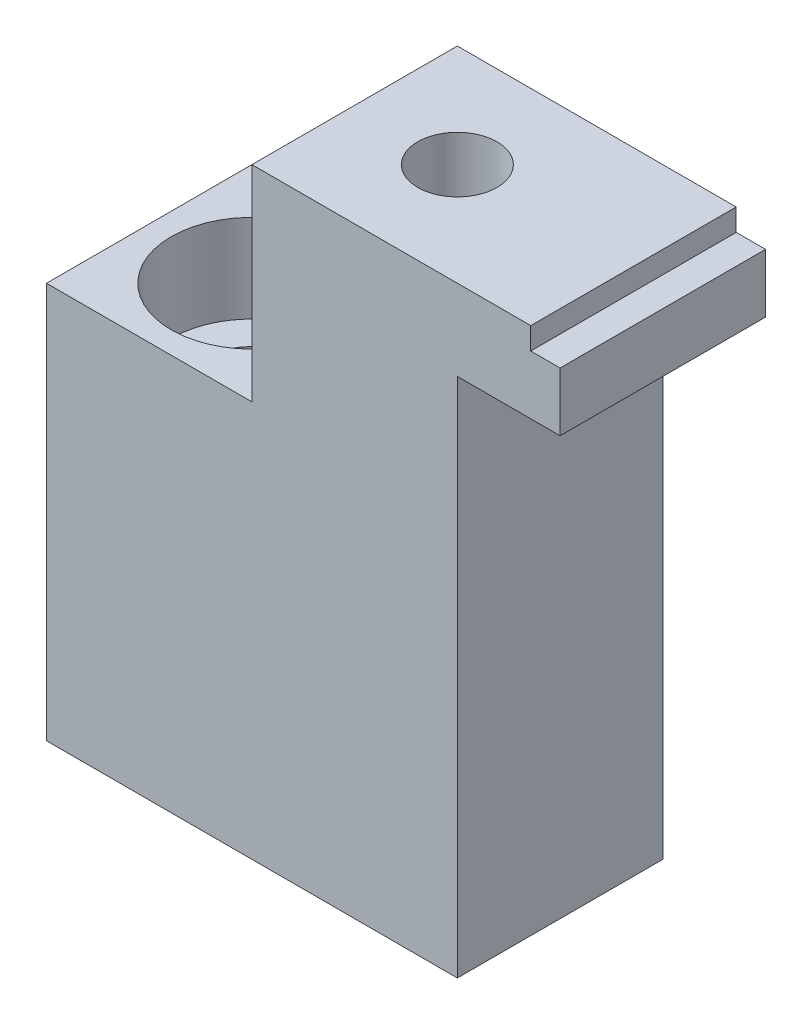
ISO-10303-21;
HEADER;
FILE_DESCRIPTION(('STEP AP214'),'2;1');
FILE_NAME('part.step','',(''),(''),'','','');
FILE_SCHEMA(('AUTOMOTIVE_DESIGN { 1 0 10303 214 1 1 1 1 }'));
ENDSEC;
DATA;
#1=APPLICATION_CONTEXT('core data for automotive mechanical design processes');
#2=APPLICATION_PROTOCOL_DEFINITION('international standard','automotive_design',2000,#1);
#3=PRODUCT_CONTEXT('',#1,'mechanical');
#4=PRODUCT('Part','Part','',(#3));
#5=PRODUCT_RELATED_PRODUCT_CATEGORY('part','',(#4));
#6=PRODUCT_DEFINITION_FORMATION('','',#4);
#7=PRODUCT_DEFINITION_CONTEXT('part definition',#1,'design');
#8=PRODUCT_DEFINITION('design','',#6,#7);
#9=PRODUCT_DEFINITION_SHAPE('','',#8);
#10=(LENGTH_UNIT() NAMED_UNIT(*) SI_UNIT(.MILLI.,.METRE.));
#11=(NAMED_UNIT(*) PLANE_ANGLE_UNIT() SI_UNIT($,.RADIAN.));
#12=(NAMED_UNIT(*) SI_UNIT($,.STERADIAN.) SOLID_ANGLE_UNIT());
#13=UNCERTAINTY_MEASURE_WITH_UNIT(LENGTH_MEASURE(1.E-05),#10,'distance_accuracy_value','');
#14=(GEOMETRIC_REPRESENTATION_CONTEXT(3) GLOBAL_UNCERTAINTY_ASSIGNED_CONTEXT((#13)) GLOBAL_UNIT_ASSIGNED_CONTEXT((#10,
#11,#12)) REPRESENTATION_CONTEXT('',''));
#15=CARTESIAN_POINT('',(0.,0.,0.));
#16=DIRECTION('',(0.,0.,1.));
#17=DIRECTION('',(1.,0.,0.));
#18=AXIS2_PLACEMENT_3D('',#15,#16,#17);
#19=CARTESIAN_POINT('',(-3.5,-4.40000000000001,3.5));
#20=DIRECTION('',(0.,1.,0.));
#21=DIRECTION('',(-1.,0.,0.));
#22=AXIS2_PLACEMENT_3D('',#19,#20,#21);
#23=CYLINDRICAL_SURFACE('',#22,1.6);
#24=CARTESIAN_POINT('',(-3.5,6.5,3.5));
#25=DIRECTION('',(0.,1.,0.));
#26=DIRECTION('',(-1.,0.,0.));
#27=AXIS2_PLACEMENT_3D('',#24,#25,#26);
#28=CIRCLE('',#27,1.6);
#29=CARTESIAN_POINT('',(-5.1,6.5,3.5));
#30=VERTEX_POINT('',#29);
#31=EDGE_CURVE('E37',#30,#30,#28,.F.);
#32=ORIENTED_EDGE('',*,*,#31,.F.);
#33=EDGE_LOOP('',(#32));
#34=FACE_BOUND('',#33,.T.);
#35=CARTESIAN_POINT('',(-3.5,-4.,3.5));
#36=DIRECTION('',(0.,1.,0.));
#37=DIRECTION('',(0.,0.,1.));
#38=AXIS2_PLACEMENT_3D('',#35,#36,#37);
#39=CIRCLE('',#38,1.6);
#40=CARTESIAN_POINT('',(-3.5,-4.,5.1));
#41=VERTEX_POINT('',#40);
#42=EDGE_CURVE('E216',#41,#41,#39,.T.);
#43=ORIENTED_EDGE('',*,*,#42,.F.);
#44=EDGE_LOOP('',(#43));
#45=FACE_BOUND('',#44,.T.);
#46=ADVANCED_FACE('F33',(#34,#45),#23,.F.);
#47=CARTESIAN_POINT('',(7.,-4.,7.));
#48=DIRECTION('',(0.,1.,0.));
#49=DIRECTION('',(0.,0.,1.));
#50=AXIS2_PLACEMENT_3D('',#47,#48,#49);
#51=PLANE('',#50);
#52=DIRECTION('',(1.,0.,0.));
#53=VECTOR('',#52,1.);
#54=CARTESIAN_POINT('',(7.,-4.,0.));
#55=LINE('',#54,#53);
#56=CARTESIAN_POINT('',(-7.,-4.,0.));
#57=VERTEX_POINT('',#56);
#58=CARTESIAN_POINT('',(7.,-4.,0.));
#59=VERTEX_POINT('',#58);
#60=EDGE_CURVE('E141',#57,#59,#55,.T.);
#61=ORIENTED_EDGE('',*,*,#60,.T.);
#62=DIRECTION('',(0.,0.,-1.));
#63=VECTOR('',#62,1.);
#64=CARTESIAN_POINT('',(7.,-4.,7.));
#65=LINE('',#64,#63);
#66=CARTESIAN_POINT('',(7.,-4.,7.));
#67=VERTEX_POINT('',#66);
#68=EDGE_CURVE('E11',#67,#59,#65,.T.);
#69=ORIENTED_EDGE('',*,*,#68,.F.);
#70=DIRECTION('',(1.,0.,0.));
#71=VECTOR('',#70,1.);
#72=CARTESIAN_POINT('',(7.,-4.,7.));
#73=LINE('',#72,#71);
#74=CARTESIAN_POINT('',(-7.,-4.,7.));
#75=VERTEX_POINT('',#74);
#76=EDGE_CURVE('E97',#75,#67,#73,.T.);
#77=ORIENTED_EDGE('',*,*,#76,.F.);
#78=DIRECTION('',(0.,0.,1.));
#79=VECTOR('',#78,1.);
#80=CARTESIAN_POINT('',(-7.,-4.,7.));
#81=LINE('',#80,#79);
#82=EDGE_CURVE('E221',#57,#75,#81,.T.);
#83=ORIENTED_EDGE('',*,*,#82,.F.);
#84=EDGE_LOOP('',(#61,#69,#77,#83));
#85=FACE_BOUND('',#84,.T.);
#86=ORIENTED_EDGE('',*,*,#42,.T.);
#87=EDGE_LOOP('',(#86));
#88=FACE_BOUND('',#87,.T.);
#89=ADVANCED_FACE('F35',(#85,#88),#51,.F.);
#90=CARTESIAN_POINT('',(7.,0.,7.));
#91=DIRECTION('',(-1.,0.,0.));
#92=DIRECTION('',(0.,0.,1.));
#93=AXIS2_PLACEMENT_3D('',#90,#91,#92);
#94=PLANE('',#93);
#95=DIRECTION('',(0.,1.,0.));
#96=VECTOR('',#95,1.);
#97=CARTESIAN_POINT('',(7.,0.,0.));
#98=LINE('',#97,#96);
#99=CARTESIAN_POINT('',(7.,13.75,0.));
#100=VERTEX_POINT('',#99);
#101=EDGE_CURVE('E144',#59,#100,#98,.T.);
#102=ORIENTED_EDGE('',*,*,#101,.T.);
#103=DIRECTION('',(0.,0.,-1.));
#104=VECTOR('',#103,1.);
#105=CARTESIAN_POINT('',(7.,13.75,7.));
#106=LINE('',#105,#104);
#107=CARTESIAN_POINT('',(7.,13.75,7.));
#108=VERTEX_POINT('',#107);
#109=EDGE_CURVE('E43',#108,#100,#106,.T.);
#110=ORIENTED_EDGE('',*,*,#109,.F.);
#111=DIRECTION('',(0.,1.,0.));
#112=VECTOR('',#111,1.);
#113=CARTESIAN_POINT('',(7.,0.,7.));
#114=LINE('',#113,#112);
#115=EDGE_CURVE('E204',#67,#108,#114,.T.);
#116=ORIENTED_EDGE('',*,*,#115,.F.);
#117=ORIENTED_EDGE('',*,*,#68,.T.);
#118=EDGE_LOOP('',(#102,#110,#116,#117));
#119=FACE_BOUND('',#118,.T.);
#120=ADVANCED_FACE('F231',(#119),#94,.F.);
#121=CARTESIAN_POINT('',(7.,13.75,7.));
#122=DIRECTION('',(0.,1.,0.));
#123=DIRECTION('',(0.,0.,1.));
#124=AXIS2_PLACEMENT_3D('',#121,#122,#123);
#125=PLANE('',#124);
#126=DIRECTION('',(1.,0.,0.));
#127=VECTOR('',#126,1.);
#128=CARTESIAN_POINT('',(7.,13.75,0.));
#129=LINE('',#128,#127);
#130=CARTESIAN_POINT('',(10.5,13.75,0.));
#131=VERTEX_POINT('',#130);
#132=EDGE_CURVE('E147',#100,#131,#129,.T.);
#133=ORIENTED_EDGE('',*,*,#132,.T.);
#134=DIRECTION('',(0.,0.,-1.));
#135=VECTOR('',#134,1.);
#136=CARTESIAN_POINT('',(10.5,13.75,7.));
#137=LINE('',#136,#135);
#138=CARTESIAN_POINT('',(10.5,13.75,7.));
#139=VERTEX_POINT('',#138);
#140=EDGE_CURVE('E171',#139,#131,#137,.T.);
#141=ORIENTED_EDGE('',*,*,#140,.F.);
#142=DIRECTION('',(1.,0.,0.));
#143=VECTOR('',#142,1.);
#144=CARTESIAN_POINT('',(7.,13.75,7.));
#145=LINE('',#144,#143);
#146=EDGE_CURVE('E181',#108,#139,#145,.T.);
#147=ORIENTED_EDGE('',*,*,#146,.F.);
#148=ORIENTED_EDGE('',*,*,#109,.T.);
#149=EDGE_LOOP('',(#133,#141,#147,#148));
#150=FACE_BOUND('',#149,.T.);
#151=ADVANCED_FACE('F179',(#150),#125,.F.);
#152=CARTESIAN_POINT('',(10.5,15.75,7.));
#153=DIRECTION('',(-1.,0.,0.));
#154=DIRECTION('',(0.,0.,1.));
#155=AXIS2_PLACEMENT_3D('',#152,#153,#154);
#156=PLANE('',#155);
#157=DIRECTION('',(0.,1.,0.));
#158=VECTOR('',#157,1.);
#159=CARTESIAN_POINT('',(10.5,15.75,0.));
#160=LINE('',#159,#158);
#161=CARTESIAN_POINT('',(10.5,15.75,0.));
#162=VERTEX_POINT('',#161);
#163=EDGE_CURVE('E149',#131,#162,#160,.T.);
#164=ORIENTED_EDGE('',*,*,#163,.T.);
#165=DIRECTION('',(0.,0.,-1.));
#166=VECTOR('',#165,1.);
#167=CARTESIAN_POINT('',(10.5,15.75,7.));
#168=LINE('',#167,#166);
#169=CARTESIAN_POINT('',(10.5,15.75,7.));
#170=VERTEX_POINT('',#169);
#171=EDGE_CURVE('E168',#170,#162,#168,.T.);
#172=ORIENTED_EDGE('',*,*,#171,.F.);
#173=DIRECTION('',(0.,1.,0.));
#174=VECTOR('',#173,1.);
#175=CARTESIAN_POINT('',(10.5,15.75,7.));
#176=LINE('',#175,#174);
#177=EDGE_CURVE('E199',#139,#170,#176,.T.);
#178=ORIENTED_EDGE('',*,*,#177,.F.);
#179=ORIENTED_EDGE('',*,*,#140,.T.);
#180=EDGE_LOOP('',(#164,#172,#178,#179));
#181=FACE_BOUND('',#180,.T.);
#182=ADVANCED_FACE('F192',(#181),#156,.F.);
#183=CARTESIAN_POINT('',(9.5,15.75,7.));
#184=DIRECTION('',(0.,-1.,0.));
#185=DIRECTION('',(0.,0.,-1.));
#186=AXIS2_PLACEMENT_3D('',#183,#184,#185);
#187=PLANE('',#186);
#188=DIRECTION('',(-1.,0.,0.));
#189=VECTOR('',#188,1.);
#190=CARTESIAN_POINT('',(9.5,15.75,0.));
#191=LINE('',#190,#189);
#192=CARTESIAN_POINT('',(9.5,15.75,0.));
#193=VERTEX_POINT('',#192);
#194=EDGE_CURVE('E151',#162,#193,#191,.T.);
#195=ORIENTED_EDGE('',*,*,#194,.T.);
#196=DIRECTION('',(0.,0.,-1.));
#197=VECTOR('',#196,1.);
#198=CARTESIAN_POINT('',(9.5,15.75,7.));
#199=LINE('',#198,#197);
#200=CARTESIAN_POINT('',(9.5,15.75,7.));
#201=VERTEX_POINT('',#200);
#202=EDGE_CURVE('E165',#201,#193,#199,.T.);
#203=ORIENTED_EDGE('',*,*,#202,.F.);
#204=DIRECTION('',(-1.,0.,0.));
#205=VECTOR('',#204,1.);
#206=CARTESIAN_POINT('',(9.5,15.75,7.));
#207=LINE('',#206,#205);
#208=EDGE_CURVE('E198',#170,#201,#207,.T.);
#209=ORIENTED_EDGE('',*,*,#208,.F.);
#210=ORIENTED_EDGE('',*,*,#171,.T.);
#211=EDGE_LOOP('',(#195,#203,#209,#210));
#212=FACE_BOUND('',#211,.T.);
#213=ADVANCED_FACE('F196',(#212),#187,.F.);
#214=CARTESIAN_POINT('',(9.5,15.75,7.));
#215=DIRECTION('',(-1.,0.,0.));
#216=DIRECTION('',(0.,0.,1.));
#217=AXIS2_PLACEMENT_3D('',#214,#215,#216);
#218=PLANE('',#217);
#219=DIRECTION('',(0.,1.,0.));
#220=VECTOR('',#219,1.);
#221=CARTESIAN_POINT('',(9.5,15.75,0.));
#222=LINE('',#221,#220);
#223=CARTESIAN_POINT('',(9.5,16.5,0.));
#224=VERTEX_POINT('',#223);
#225=EDGE_CURVE('E153',#193,#224,#222,.T.);
#226=ORIENTED_EDGE('',*,*,#225,.T.);
#227=DIRECTION('',(0.,0.,-1.));
#228=VECTOR('',#227,1.);
#229=CARTESIAN_POINT('',(9.5,16.5,7.));
#230=LINE('',#229,#228);
#231=CARTESIAN_POINT('',(9.5,16.5,7.));
#232=VERTEX_POINT('',#231);
#233=EDGE_CURVE('E130',#232,#224,#230,.T.);
#234=ORIENTED_EDGE('',*,*,#233,.F.);
#235=DIRECTION('',(0.,1.,0.));
#236=VECTOR('',#235,1.);
#237=CARTESIAN_POINT('',(9.5,15.75,7.));
#238=LINE('',#237,#236);
#239=EDGE_CURVE('E122',#201,#232,#238,.T.);
#240=ORIENTED_EDGE('',*,*,#239,.F.);
#241=ORIENTED_EDGE('',*,*,#202,.T.);
#242=EDGE_LOOP('',(#226,#234,#240,#241));
#243=FACE_BOUND('',#242,.T.);
#244=ADVANCED_FACE('F273',(#243),#218,.F.);
#245=CARTESIAN_POINT('',(7.,16.5,7.));
#246=DIRECTION('',(0.,-1.,0.));
#247=DIRECTION('',(0.,0.,-1.));
#248=AXIS2_PLACEMENT_3D('',#245,#246,#247);
#249=PLANE('',#248);
#250=CARTESIAN_POINT('',(3.5,16.5,3.5));
#251=DIRECTION('',(0.,1.,0.));
#252=DIRECTION('',(0.,0.,1.));
#253=AXIS2_PLACEMENT_3D('',#250,#251,#252);
#254=CIRCLE('',#253,1.35);
#255=CARTESIAN_POINT('',(3.5,16.5,4.85));
#256=VERTEX_POINT('',#255);
#257=EDGE_CURVE('E207',#256,#256,#254,.T.);
#258=ORIENTED_EDGE('',*,*,#257,.F.);
#259=EDGE_LOOP('',(#258));
#260=FACE_BOUND('',#259,.T.);
#261=DIRECTION('',(-1.,0.,0.));
#262=VECTOR('',#261,1.);
#263=CARTESIAN_POINT('',(7.,16.5,0.));
#264=LINE('',#263,#262);
#265=CARTESIAN_POINT('',(0.,16.5,0.));
#266=VERTEX_POINT('',#265);
#267=EDGE_CURVE('E129',#224,#266,#264,.T.);
#268=ORIENTED_EDGE('',*,*,#267,.T.);
#269=DIRECTION('',(0.,0.,-1.));
#270=VECTOR('',#269,1.);
#271=CARTESIAN_POINT('',(0.,16.5,7.));
#272=LINE('',#271,#270);
#273=CARTESIAN_POINT('',(0.,16.5,7.));
#274=VERTEX_POINT('',#273);
#275=EDGE_CURVE('E127',#274,#266,#272,.T.);
#276=ORIENTED_EDGE('',*,*,#275,.F.);
#277=DIRECTION('',(-1.,0.,0.));
#278=VECTOR('',#277,1.);
#279=CARTESIAN_POINT('',(7.,16.5,7.));
#280=LINE('',#279,#278);
#281=EDGE_CURVE('E116',#232,#274,#280,.T.);
#282=ORIENTED_EDGE('',*,*,#281,.F.);
#283=ORIENTED_EDGE('',*,*,#233,.T.);
#284=EDGE_LOOP('',(#268,#276,#282,#283));
#285=FACE_BOUND('',#284,.T.);
#286=ADVANCED_FACE('F128',(#260,#285),#249,.F.);
#287=CARTESIAN_POINT('',(0.,9.5,7.));
#288=DIRECTION('',(1.,0.,0.));
#289=DIRECTION('',(0.,0.,-1.));
#290=AXIS2_PLACEMENT_3D('',#287,#288,#289);
#291=PLANE('',#290);
#292=DIRECTION('',(0.,-1.,0.));
#293=VECTOR('',#292,1.);
#294=CARTESIAN_POINT('',(0.,9.5,0.));
#295=LINE('',#294,#293);
#296=CARTESIAN_POINT('',(0.,9.5,0.));
#297=VERTEX_POINT('',#296);
#298=EDGE_CURVE('E84',#266,#297,#295,.T.);
#299=ORIENTED_EDGE('',*,*,#298,.T.);
#300=DIRECTION('',(0.,0.,-1.));
#301=VECTOR('',#300,1.);
#302=CARTESIAN_POINT('',(0.,9.5,7.));
#303=LINE('',#302,#301);
#304=CARTESIAN_POINT('',(0.,9.5,7.));
#305=VERTEX_POINT('',#304);
#306=EDGE_CURVE('E131',#305,#297,#303,.T.);
#307=ORIENTED_EDGE('',*,*,#306,.F.);
#308=DIRECTION('',(0.,-1.,0.));
#309=VECTOR('',#308,1.);
#310=CARTESIAN_POINT('',(0.,9.5,7.));
#311=LINE('',#310,#309);
#312=EDGE_CURVE('E120',#274,#305,#311,.T.);
#313=ORIENTED_EDGE('',*,*,#312,.F.);
#314=ORIENTED_EDGE('',*,*,#275,.T.);
#315=EDGE_LOOP('',(#299,#307,#313,#314));
#316=FACE_BOUND('',#315,.T.);
#317=ADVANCED_FACE('F133',(#316),#291,.F.);
#318=CARTESIAN_POINT('',(0.,9.5,7.));
#319=DIRECTION('',(0.,-1.,0.));
#320=DIRECTION('',(0.,0.,-1.));
#321=AXIS2_PLACEMENT_3D('',#318,#319,#320);
#322=PLANE('',#321);
#323=CARTESIAN_POINT('',(-3.5,9.5,3.5));
#324=DIRECTION('',(0.,1.,0.));
#325=DIRECTION('',(-1.,0.,0.));
#326=AXIS2_PLACEMENT_3D('',#323,#324,#325);
#327=CIRCLE('',#326,2.75);
#328=CARTESIAN_POINT('',(-6.25,9.5,3.5));
#329=VERTEX_POINT('',#328);
#330=EDGE_CURVE('E212',#329,#329,#327,.T.);
#331=ORIENTED_EDGE('',*,*,#330,.F.);
#332=EDGE_LOOP('',(#331));
#333=FACE_BOUND('',#332,.T.);
#334=DIRECTION('',(-1.,0.,0.));
#335=VECTOR('',#334,1.);
#336=CARTESIAN_POINT('',(0.,9.5,0.));
#337=LINE('',#336,#335);
#338=CARTESIAN_POINT('',(-7.,9.5,0.));
#339=VERTEX_POINT('',#338);
#340=EDGE_CURVE('E90',#297,#339,#337,.T.);
#341=ORIENTED_EDGE('',*,*,#340,.T.);
#342=DIRECTION('',(0.,0.,-1.));
#343=VECTOR('',#342,1.);
#344=CARTESIAN_POINT('',(-7.,9.5,7.));
#345=LINE('',#344,#343);
#346=CARTESIAN_POINT('',(-7.,9.5,7.));
#347=VERTEX_POINT('',#346);
#348=EDGE_CURVE('E140',#347,#339,#345,.T.);
#349=ORIENTED_EDGE('',*,*,#348,.F.);
#350=DIRECTION('',(-1.,0.,0.));
#351=VECTOR('',#350,1.);
#352=CARTESIAN_POINT('',(0.,9.5,7.));
#353=LINE('',#352,#351);
#354=EDGE_CURVE('E51',#305,#347,#353,.T.);
#355=ORIENTED_EDGE('',*,*,#354,.F.);
#356=ORIENTED_EDGE('',*,*,#306,.T.);
#357=EDGE_LOOP('',(#341,#349,#355,#356));
#358=FACE_BOUND('',#357,.T.);
#359=ADVANCED_FACE('F265',(#333,#358),#322,.F.);
#360=CARTESIAN_POINT('',(-7.,0.,7.));
#361=DIRECTION('',(1.,0.,0.));
#362=DIRECTION('',(0.,0.,-1.));
#363=AXIS2_PLACEMENT_3D('',#360,#361,#362);
#364=PLANE('',#363);
#365=DIRECTION('',(0.,-1.,0.));
#366=VECTOR('',#365,1.);
#367=CARTESIAN_POINT('',(-7.,0.,0.));
#368=LINE('',#367,#366);
#369=EDGE_CURVE('E159',#339,#57,#368,.T.);
#370=ORIENTED_EDGE('',*,*,#369,.T.);
#371=ORIENTED_EDGE('',*,*,#82,.T.);
#372=DIRECTION('',(0.,-1.,0.));
#373=VECTOR('',#372,1.);
#374=CARTESIAN_POINT('',(-7.,0.,7.));
#375=LINE('',#374,#373);
#376=EDGE_CURVE('E135',#347,#75,#375,.T.);
#377=ORIENTED_EDGE('',*,*,#376,.F.);
#378=ORIENTED_EDGE('',*,*,#348,.T.);
#379=EDGE_LOOP('',(#370,#371,#377,#378));
#380=FACE_BOUND('',#379,.T.);
#381=ADVANCED_FACE('F227',(#380),#364,.F.);
#382=CARTESIAN_POINT('',(0.,0.,7.));
#383=DIRECTION('',(0.,0.,-1.));
#384=DIRECTION('',(-1.,0.,0.));
#385=AXIS2_PLACEMENT_3D('',#382,#383,#384);
#386=PLANE('',#385);
#387=ORIENTED_EDGE('',*,*,#376,.T.);
#388=ORIENTED_EDGE('',*,*,#76,.T.);
#389=ORIENTED_EDGE('',*,*,#115,.T.);
#390=ORIENTED_EDGE('',*,*,#146,.T.);
#391=ORIENTED_EDGE('',*,*,#177,.T.);
#392=ORIENTED_EDGE('',*,*,#208,.T.);
#393=ORIENTED_EDGE('',*,*,#239,.T.);
#394=ORIENTED_EDGE('',*,*,#281,.T.);
#395=ORIENTED_EDGE('',*,*,#312,.T.);
#396=ORIENTED_EDGE('',*,*,#354,.T.);
#397=EDGE_LOOP('',(#387,#388,#389,#390,#391,#392,#393,#394,#395,#396));
#398=FACE_BOUND('',#397,.T.);
#399=ADVANCED_FACE('F118',(#398),#386,.F.);
#400=CARTESIAN_POINT('',(0.,0.,0.));
#401=DIRECTION('',(0.,0.,-1.));
#402=DIRECTION('',(-1.,0.,0.));
#403=AXIS2_PLACEMENT_3D('',#400,#401,#402);
#404=PLANE('',#403);
#405=ORIENTED_EDGE('',*,*,#60,.F.);
#406=ORIENTED_EDGE('',*,*,#369,.F.);
#407=ORIENTED_EDGE('',*,*,#340,.F.);
#408=ORIENTED_EDGE('',*,*,#298,.F.);
#409=ORIENTED_EDGE('',*,*,#267,.F.);
#410=ORIENTED_EDGE('',*,*,#225,.F.);
#411=ORIENTED_EDGE('',*,*,#194,.F.);
#412=ORIENTED_EDGE('',*,*,#163,.F.);
#413=ORIENTED_EDGE('',*,*,#132,.F.);
#414=ORIENTED_EDGE('',*,*,#101,.F.);
#415=EDGE_LOOP('',(#405,#406,#407,#408,#409,#410,#411,#412,#413,#414));
#416=FACE_BOUND('',#415,.T.);
#417=ADVANCED_FACE('F187',(#416),#404,.T.);
#418=CARTESIAN_POINT('',(3.5,3.,3.5));
#419=DIRECTION('',(0.,1.,0.));
#420=DIRECTION('',(0.,0.,1.));
#421=AXIS2_PLACEMENT_3D('',#418,#419,#420);
#422=CYLINDRICAL_SURFACE('',#421,1.35);
#423=CARTESIAN_POINT('',(3.5,3.,3.5));
#424=DIRECTION('',(0.,1.,0.));
#425=DIRECTION('',(0.,0.,1.));
#426=AXIS2_PLACEMENT_3D('',#423,#424,#425);
#427=CIRCLE('',#426,1.35);
#428=CARTESIAN_POINT('',(3.5,3.,4.85));
#429=VERTEX_POINT('',#428);
#430=EDGE_CURVE('E145',#429,#429,#427,.T.);
#431=ORIENTED_EDGE('',*,*,#430,.F.);
#432=EDGE_LOOP('',(#431));
#433=FACE_BOUND('',#432,.T.);
#434=ORIENTED_EDGE('',*,*,#257,.T.);
#435=EDGE_LOOP('',(#434));
#436=FACE_BOUND('',#435,.T.);
#437=ADVANCED_FACE('F254',(#433,#436),#422,.F.);
#438=CARTESIAN_POINT('',(3.5,3.,3.5));
#439=DIRECTION('',(0.,1.,0.));
#440=DIRECTION('',(0.,0.,1.));
#441=AXIS2_PLACEMENT_3D('',#438,#439,#440);
#442=PLANE('',#441);
#443=ORIENTED_EDGE('',*,*,#430,.T.);
#444=EDGE_LOOP('',(#443));
#445=FACE_BOUND('',#444,.T.);
#446=ADVANCED_FACE('F250',(#445),#442,.T.);
#447=CARTESIAN_POINT('',(-3.5,6.5,3.5));
#448=DIRECTION('',(0.,1.,0.));
#449=DIRECTION('',(-1.,0.,0.));
#450=AXIS2_PLACEMENT_3D('',#447,#448,#449);
#451=PLANE('',#450);
#452=CARTESIAN_POINT('',(-3.5,6.5,3.5));
#453=DIRECTION('',(0.,1.,0.));
#454=DIRECTION('',(-1.,0.,0.));
#455=AXIS2_PLACEMENT_3D('',#452,#453,#454);
#456=CIRCLE('',#455,2.75);
#457=CARTESIAN_POINT('',(-6.25,6.5,3.5));
#458=VERTEX_POINT('',#457);
#459=EDGE_CURVE('E215',#458,#458,#456,.T.);
#460=ORIENTED_EDGE('',*,*,#459,.T.);
#461=EDGE_LOOP('',(#460));
#462=FACE_BOUND('',#461,.T.);
#463=ORIENTED_EDGE('',*,*,#31,.T.);
#464=EDGE_LOOP('',(#463));
#465=FACE_BOUND('',#464,.T.);
#466=ADVANCED_FACE('F253',(#462,#465),#451,.T.);
#467=CARTESIAN_POINT('',(-3.5,6.5,3.5));
#468=DIRECTION('',(0.,1.,0.));
#469=DIRECTION('',(-1.,0.,0.));
#470=AXIS2_PLACEMENT_3D('',#467,#468,#469);
#471=CYLINDRICAL_SURFACE('',#470,2.75);
#472=ORIENTED_EDGE('',*,*,#459,.F.);
#473=EDGE_LOOP('',(#472));
#474=FACE_BOUND('',#473,.T.);
#475=ORIENTED_EDGE('',*,*,#330,.T.);
#476=EDGE_LOOP('',(#475));
#477=FACE_BOUND('',#476,.T.);
#478=ADVANCED_FACE('F248',(#474,#477),#471,.F.);
#479=CLOSED_SHELL('',(#46,#89,#120,#151,#182,#213,#244,#286,#317,#359,#381,#399,#417,#437,#446,
#466,#478));
#480=MANIFOLD_SOLID_BREP('B2',#479);
#481=ADVANCED_BREP_SHAPE_REPRESENTATION('',(#18,#480),#14);
#482=SHAPE_DEFINITION_REPRESENTATION(#9,#481);
ENDSEC;
END-ISO-10303-21;
